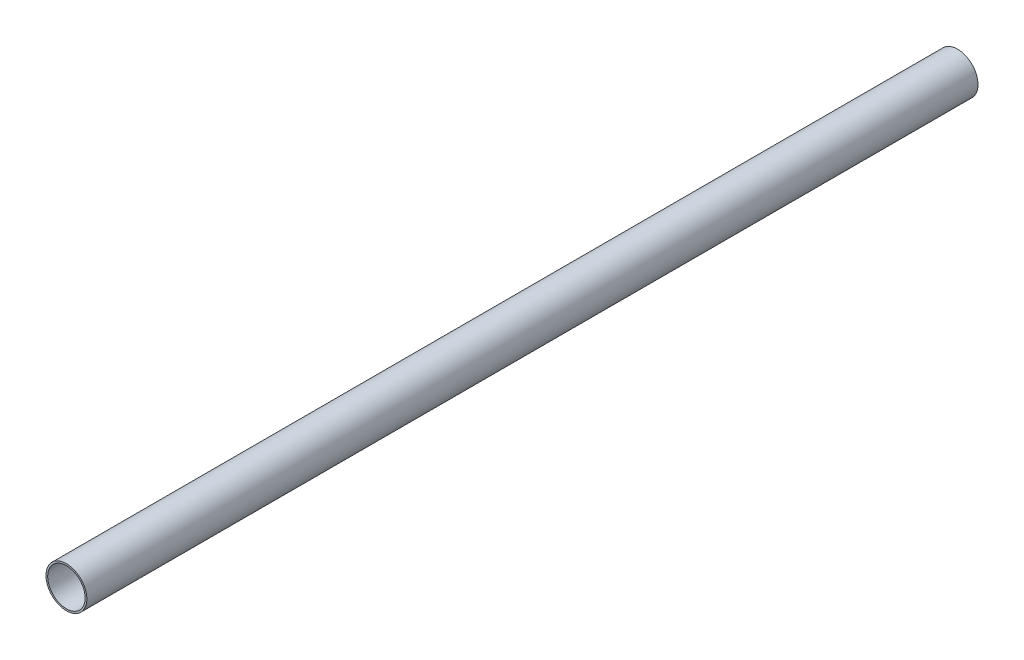
ISO-10303-21;
HEADER;
FILE_DESCRIPTION(('STEP AP214'),'2;1');
FILE_NAME('part.step','',(''),(''),'','','');
FILE_SCHEMA(('AUTOMOTIVE_DESIGN { 1 0 10303 214 1 1 1 1 }'));
ENDSEC;
DATA;
#1=APPLICATION_CONTEXT('core data for automotive mechanical design processes');
#2=APPLICATION_PROTOCOL_DEFINITION('international standard','automotive_design',2000,#1);
#3=PRODUCT_CONTEXT('',#1,'mechanical');
#4=PRODUCT('Part','Part','',(#3));
#5=PRODUCT_RELATED_PRODUCT_CATEGORY('part','',(#4));
#6=PRODUCT_DEFINITION_FORMATION('','',#4);
#7=PRODUCT_DEFINITION_CONTEXT('part definition',#1,'design');
#8=PRODUCT_DEFINITION('design','',#6,#7);
#9=PRODUCT_DEFINITION_SHAPE('','',#8);
#10=(LENGTH_UNIT() NAMED_UNIT(*) SI_UNIT(.MILLI.,.METRE.));
#11=(NAMED_UNIT(*) PLANE_ANGLE_UNIT() SI_UNIT($,.RADIAN.));
#12=(NAMED_UNIT(*) SI_UNIT($,.STERADIAN.) SOLID_ANGLE_UNIT());
#13=UNCERTAINTY_MEASURE_WITH_UNIT(LENGTH_MEASURE(1.E-05),#10,'distance_accuracy_value','');
#14=(GEOMETRIC_REPRESENTATION_CONTEXT(3) GLOBAL_UNCERTAINTY_ASSIGNED_CONTEXT((#13)) GLOBAL_UNIT_ASSIGNED_CONTEXT((#10,
#11,#12)) REPRESENTATION_CONTEXT('',''));
#15=CARTESIAN_POINT('',(0.,0.,0.));
#16=DIRECTION('',(0.,0.,1.));
#17=DIRECTION('',(1.,0.,0.));
#18=AXIS2_PLACEMENT_3D('',#15,#16,#17);
#19=CARTESIAN_POINT('',(0.,0.,553.63));
#20=DIRECTION('',(0.,0.,1.));
#21=DIRECTION('',(1.,0.,0.));
#22=AXIS2_PLACEMENT_3D('',#19,#20,#21);
#23=PLANE('',#22);
#24=CARTESIAN_POINT('',(0.,0.,553.63));
#25=DIRECTION('',(0.,0.,1.));
#26=DIRECTION('',(1.,0.,0.));
#27=AXIS2_PLACEMENT_3D('',#24,#25,#26);
#28=CIRCLE('',#27,12.7);
#29=CARTESIAN_POINT('',(12.7,0.,553.63));
#30=VERTEX_POINT('',#29);
#31=EDGE_CURVE('E10',#30,#30,#28,.T.);
#32=ORIENTED_EDGE('',*,*,#31,.T.);
#33=EDGE_LOOP('',(#32));
#34=FACE_BOUND('',#33,.T.);
#35=CARTESIAN_POINT('',(0.,0.,553.63));
#36=DIRECTION('',(0.,0.,1.));
#37=DIRECTION('',(1.,0.,0.));
#38=AXIS2_PLACEMENT_3D('',#35,#36,#37);
#39=CIRCLE('',#38,11.6205);
#40=CARTESIAN_POINT('',(11.6205,0.,553.63));
#41=VERTEX_POINT('',#40);
#42=EDGE_CURVE('E47',#41,#41,#39,.T.);
#43=ORIENTED_EDGE('',*,*,#42,.F.);
#44=EDGE_LOOP('',(#43));
#45=FACE_BOUND('',#44,.T.);
#46=ADVANCED_FACE('F36',(#34,#45),#23,.T.);
#47=CARTESIAN_POINT('',(0.,0.,0.));
#48=DIRECTION('',(0.,0.,1.));
#49=DIRECTION('',(1.,0.,0.));
#50=AXIS2_PLACEMENT_3D('',#47,#48,#49);
#51=PLANE('',#50);
#52=CARTESIAN_POINT('',(0.,0.,0.));
#53=DIRECTION('',(0.,0.,1.));
#54=DIRECTION('',(1.,0.,0.));
#55=AXIS2_PLACEMENT_3D('',#52,#53,#54);
#56=CIRCLE('',#55,12.7);
#57=CARTESIAN_POINT('',(12.7,0.,0.));
#58=VERTEX_POINT('',#57);
#59=EDGE_CURVE('E40',#58,#58,#56,.T.);
#60=ORIENTED_EDGE('',*,*,#59,.F.);
#61=EDGE_LOOP('',(#60));
#62=FACE_BOUND('',#61,.T.);
#63=CARTESIAN_POINT('',(0.,0.,0.));
#64=DIRECTION('',(0.,0.,1.));
#65=DIRECTION('',(1.,0.,0.));
#66=AXIS2_PLACEMENT_3D('',#63,#64,#65);
#67=CIRCLE('',#66,11.6205);
#68=CARTESIAN_POINT('',(11.6205,0.,0.));
#69=VERTEX_POINT('',#68);
#70=EDGE_CURVE('E49',#69,#69,#67,.T.);
#71=ORIENTED_EDGE('',*,*,#70,.T.);
#72=EDGE_LOOP('',(#71));
#73=FACE_BOUND('',#72,.T.);
#74=ADVANCED_FACE('F59',(#62,#73),#51,.F.);
#75=CARTESIAN_POINT('',(0.,0.,553.63));
#76=DIRECTION('',(0.,0.,-1.));
#77=DIRECTION('',(-1.,0.,0.));
#78=AXIS2_PLACEMENT_3D('',#75,#76,#77);
#79=CYLINDRICAL_SURFACE('',#78,12.7);
#80=ORIENTED_EDGE('',*,*,#31,.F.);
#81=EDGE_LOOP('',(#80));
#82=FACE_BOUND('',#81,.T.);
#83=ORIENTED_EDGE('',*,*,#59,.T.);
#84=EDGE_LOOP('',(#83));
#85=FACE_BOUND('',#84,.T.);
#86=ADVANCED_FACE('F38',(#82,#85),#79,.T.);
#87=CARTESIAN_POINT('',(0.,0.,553.63));
#88=DIRECTION('',(0.,0.,-1.));
#89=DIRECTION('',(-1.,0.,0.));
#90=AXIS2_PLACEMENT_3D('',#87,#88,#89);
#91=CYLINDRICAL_SURFACE('',#90,11.6205);
#92=ORIENTED_EDGE('',*,*,#42,.T.);
#93=EDGE_LOOP('',(#92));
#94=FACE_BOUND('',#93,.T.);
#95=ORIENTED_EDGE('',*,*,#70,.F.);
#96=EDGE_LOOP('',(#95));
#97=FACE_BOUND('',#96,.T.);
#98=ADVANCED_FACE('F55',(#94,#97),#91,.F.);
#99=CLOSED_SHELL('',(#46,#74,#86,#98));
#100=MANIFOLD_SOLID_BREP('B2',#99);
#101=ADVANCED_BREP_SHAPE_REPRESENTATION('',(#18,#100),#14);
#102=SHAPE_DEFINITION_REPRESENTATION(#9,#101);
ENDSEC;
END-ISO-10303-21;
